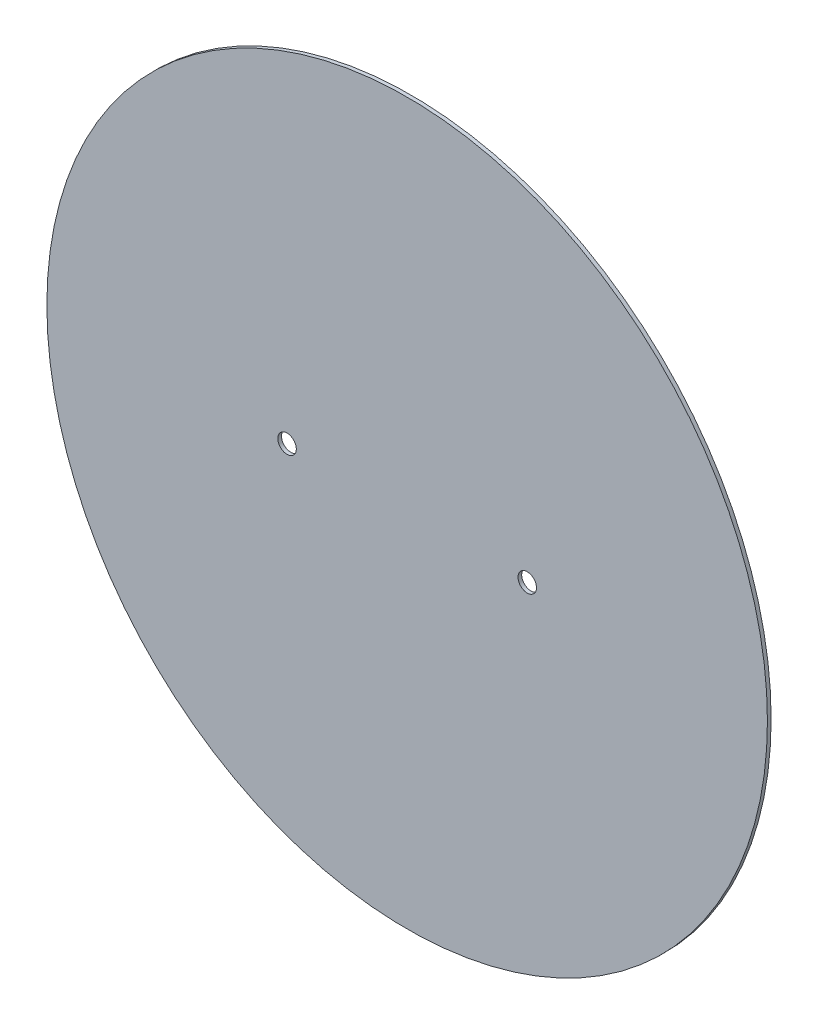
ISO-10303-21;
HEADER;
FILE_DESCRIPTION(('STEP AP214'),'2;1');
FILE_NAME('part.step','',(''),(''),'','','');
FILE_SCHEMA(('AUTOMOTIVE_DESIGN { 1 0 10303 214 1 1 1 1 }'));
ENDSEC;
DATA;
#1=APPLICATION_CONTEXT('core data for automotive mechanical design processes');
#2=APPLICATION_PROTOCOL_DEFINITION('international standard','automotive_design',2000,#1);
#3=PRODUCT_CONTEXT('',#1,'mechanical');
#4=PRODUCT('Part','Part','',(#3));
#5=PRODUCT_RELATED_PRODUCT_CATEGORY('part','',(#4));
#6=PRODUCT_DEFINITION_FORMATION('','',#4);
#7=PRODUCT_DEFINITION_CONTEXT('part definition',#1,'design');
#8=PRODUCT_DEFINITION('design','',#6,#7);
#9=PRODUCT_DEFINITION_SHAPE('','',#8);
#10=(LENGTH_UNIT() NAMED_UNIT(*) SI_UNIT(.MILLI.,.METRE.));
#11=(NAMED_UNIT(*) PLANE_ANGLE_UNIT() SI_UNIT($,.RADIAN.));
#12=(NAMED_UNIT(*) SI_UNIT($,.STERADIAN.) SOLID_ANGLE_UNIT());
#13=UNCERTAINTY_MEASURE_WITH_UNIT(LENGTH_MEASURE(1.E-05),#10,'distance_accuracy_value','');
#14=(GEOMETRIC_REPRESENTATION_CONTEXT(3) GLOBAL_UNCERTAINTY_ASSIGNED_CONTEXT((#13)) GLOBAL_UNIT_ASSIGNED_CONTEXT((#10,
#11,#12)) REPRESENTATION_CONTEXT('',''));
#15=CARTESIAN_POINT('',(0.,0.,0.));
#16=DIRECTION('',(0.,0.,1.));
#17=DIRECTION('',(1.,0.,0.));
#18=AXIS2_PLACEMENT_3D('',#15,#16,#17);
#19=CARTESIAN_POINT('',(0.,0.,-1.));
#20=DIRECTION('',(0.,0.,1.));
#21=DIRECTION('',(1.,0.,0.));
#22=AXIS2_PLACEMENT_3D('',#19,#20,#21);
#23=CYLINDRICAL_SURFACE('',#22,97.5);
#24=CARTESIAN_POINT('',(0.,0.,-1.));
#25=DIRECTION('',(0.,0.,1.));
#26=DIRECTION('',(1.,0.,0.));
#27=AXIS2_PLACEMENT_3D('',#24,#25,#26);
#28=CIRCLE('',#27,97.5);
#29=CARTESIAN_POINT('',(97.5,0.,-1.));
#30=VERTEX_POINT('',#29);
#31=EDGE_CURVE('E12',#30,#30,#28,.T.);
#32=ORIENTED_EDGE('',*,*,#31,.T.);
#33=EDGE_LOOP('',(#32));
#34=FACE_BOUND('',#33,.T.);
#35=CARTESIAN_POINT('',(0.,0.,0.));
#36=DIRECTION('',(0.,0.,1.));
#37=DIRECTION('',(1.,0.,0.));
#38=AXIS2_PLACEMENT_3D('',#35,#36,#37);
#39=CIRCLE('',#38,97.5);
#40=CARTESIAN_POINT('',(97.5,0.,0.));
#41=VERTEX_POINT('',#40);
#42=EDGE_CURVE('E56',#41,#41,#39,.T.);
#43=ORIENTED_EDGE('',*,*,#42,.F.);
#44=EDGE_LOOP('',(#43));
#45=FACE_BOUND('',#44,.T.);
#46=ADVANCED_FACE('F53',(#34,#45),#23,.T.);
#47=CARTESIAN_POINT('',(0.,0.,-1.));
#48=DIRECTION('',(0.,0.,1.));
#49=DIRECTION('',(1.,0.,0.));
#50=AXIS2_PLACEMENT_3D('',#47,#48,#49);
#51=PLANE('',#50);
#52=CARTESIAN_POINT('',(32.5,0.,-1.));
#53=DIRECTION('',(0.,0.,-1.));
#54=DIRECTION('',(-1.,0.,0.));
#55=AXIS2_PLACEMENT_3D('',#52,#53,#54);
#56=CIRCLE('',#55,2.5);
#57=CARTESIAN_POINT('',(30.,0.,-1.));
#58=VERTEX_POINT('',#57);
#59=EDGE_CURVE('E76',#58,#58,#56,.T.);
#60=ORIENTED_EDGE('',*,*,#59,.F.);
#61=EDGE_LOOP('',(#60));
#62=FACE_BOUND('',#61,.T.);
#63=CARTESIAN_POINT('',(-32.5,0.,-1.));
#64=DIRECTION('',(0.,0.,-1.));
#65=DIRECTION('',(-1.,0.,0.));
#66=AXIS2_PLACEMENT_3D('',#63,#64,#65);
#67=CIRCLE('',#66,2.5);
#68=CARTESIAN_POINT('',(-35.,0.,-1.));
#69=VERTEX_POINT('',#68);
#70=EDGE_CURVE('E68',#69,#69,#67,.T.);
#71=ORIENTED_EDGE('',*,*,#70,.F.);
#72=EDGE_LOOP('',(#71));
#73=FACE_BOUND('',#72,.T.);
#74=ORIENTED_EDGE('',*,*,#31,.F.);
#75=EDGE_LOOP('',(#74));
#76=FACE_BOUND('',#75,.T.);
#77=ADVANCED_FACE('F95',(#62,#73,#76),#51,.F.);
#78=CARTESIAN_POINT('',(0.,0.,0.));
#79=DIRECTION('',(0.,0.,1.));
#80=DIRECTION('',(1.,0.,0.));
#81=AXIS2_PLACEMENT_3D('',#78,#79,#80);
#82=PLANE('',#81);
#83=CARTESIAN_POINT('',(32.5,0.,0.));
#84=DIRECTION('',(0.,0.,-1.));
#85=DIRECTION('',(-1.,0.,0.));
#86=AXIS2_PLACEMENT_3D('',#83,#84,#85);
#87=CIRCLE('',#86,2.5);
#88=CARTESIAN_POINT('',(30.,0.,0.));
#89=VERTEX_POINT('',#88);
#90=EDGE_CURVE('E66',#89,#89,#87,.T.);
#91=ORIENTED_EDGE('',*,*,#90,.T.);
#92=EDGE_LOOP('',(#91));
#93=FACE_BOUND('',#92,.T.);
#94=CARTESIAN_POINT('',(-32.5,0.,0.));
#95=DIRECTION('',(0.,0.,-1.));
#96=DIRECTION('',(-1.,0.,0.));
#97=AXIS2_PLACEMENT_3D('',#94,#95,#96);
#98=CIRCLE('',#97,2.5);
#99=CARTESIAN_POINT('',(-35.,0.,0.));
#100=VERTEX_POINT('',#99);
#101=EDGE_CURVE('E72',#100,#100,#98,.T.);
#102=ORIENTED_EDGE('',*,*,#101,.T.);
#103=EDGE_LOOP('',(#102));
#104=FACE_BOUND('',#103,.T.);
#105=ORIENTED_EDGE('',*,*,#42,.T.);
#106=EDGE_LOOP('',(#105));
#107=FACE_BOUND('',#106,.T.);
#108=ADVANCED_FACE('F85',(#93,#104,#107),#82,.T.);
#109=CARTESIAN_POINT('',(-32.5,0.,0.));
#110=DIRECTION('',(0.,0.,-1.));
#111=DIRECTION('',(-1.,0.,0.));
#112=AXIS2_PLACEMENT_3D('',#109,#110,#111);
#113=CYLINDRICAL_SURFACE('',#112,2.5);
#114=ORIENTED_EDGE('',*,*,#101,.F.);
#115=EDGE_LOOP('',(#114));
#116=FACE_BOUND('',#115,.T.);
#117=ORIENTED_EDGE('',*,*,#70,.T.);
#118=EDGE_LOOP('',(#117));
#119=FACE_BOUND('',#118,.T.);
#120=ADVANCED_FACE('F91',(#116,#119),#113,.F.);
#121=CARTESIAN_POINT('',(32.5,0.,0.));
#122=DIRECTION('',(0.,0.,-1.));
#123=DIRECTION('',(-1.,0.,0.));
#124=AXIS2_PLACEMENT_3D('',#121,#122,#123);
#125=CYLINDRICAL_SURFACE('',#124,2.5);
#126=ORIENTED_EDGE('',*,*,#90,.F.);
#127=EDGE_LOOP('',(#126));
#128=FACE_BOUND('',#127,.T.);
#129=ORIENTED_EDGE('',*,*,#59,.T.);
#130=EDGE_LOOP('',(#129));
#131=FACE_BOUND('',#130,.T.);
#132=ADVANCED_FACE('F88',(#128,#131),#125,.F.);
#133=CLOSED_SHELL('',(#46,#77,#108,#120,#132));
#134=MANIFOLD_SOLID_BREP('B2',#133);
#135=ADVANCED_BREP_SHAPE_REPRESENTATION('',(#18,#134),#14);
#136=SHAPE_DEFINITION_REPRESENTATION(#9,#135);
ENDSEC;
END-ISO-10303-21;
